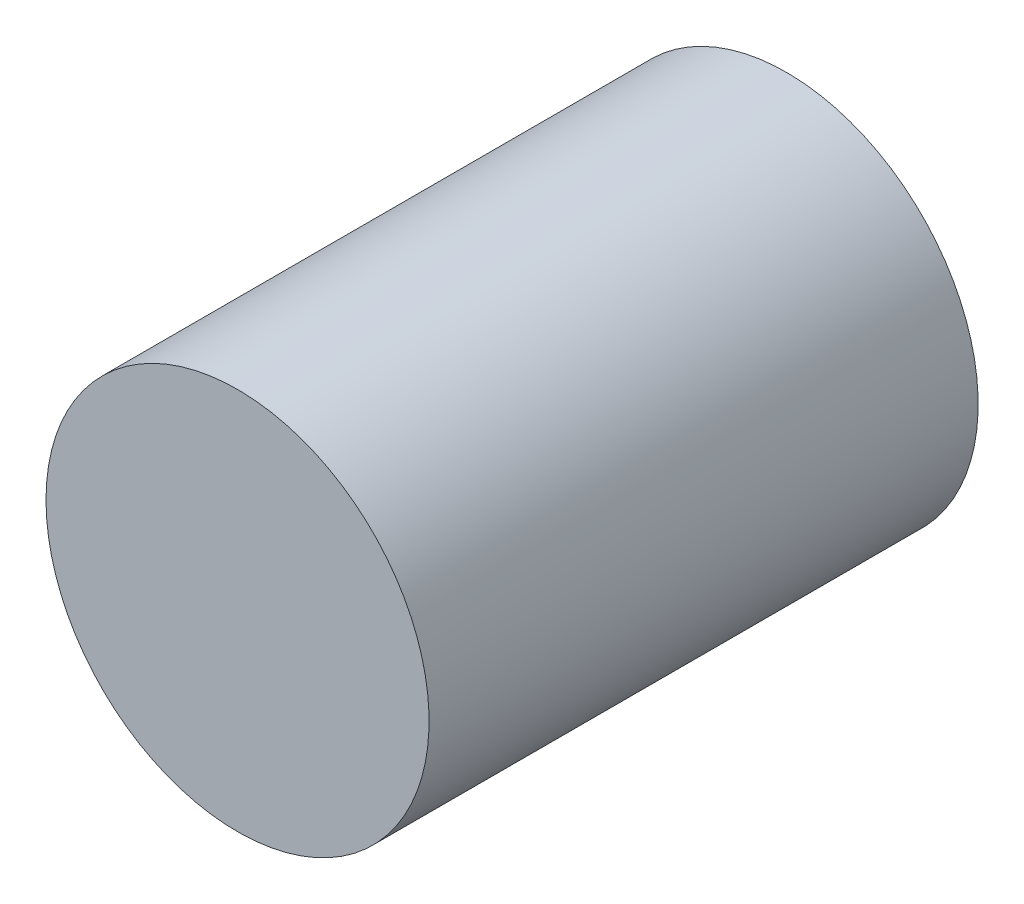
ISO-10303-21;
HEADER;
FILE_DESCRIPTION(('STEP AP214'),'2;1');
FILE_NAME('part.step','',(''),(''),'','','');
FILE_SCHEMA(('AUTOMOTIVE_DESIGN { 1 0 10303 214 1 1 1 1 }'));
ENDSEC;
DATA;
#1=APPLICATION_CONTEXT('core data for automotive mechanical design processes');
#2=APPLICATION_PROTOCOL_DEFINITION('international standard','automotive_design',2000,#1);
#3=PRODUCT_CONTEXT('',#1,'mechanical');
#4=PRODUCT('Part','Part','',(#3));
#5=PRODUCT_RELATED_PRODUCT_CATEGORY('part','',(#4));
#6=PRODUCT_DEFINITION_FORMATION('','',#4);
#7=PRODUCT_DEFINITION_CONTEXT('part definition',#1,'design');
#8=PRODUCT_DEFINITION('design','',#6,#7);
#9=PRODUCT_DEFINITION_SHAPE('','',#8);
#10=(LENGTH_UNIT() NAMED_UNIT(*) SI_UNIT(.MILLI.,.METRE.));
#11=(NAMED_UNIT(*) PLANE_ANGLE_UNIT() SI_UNIT($,.RADIAN.));
#12=(NAMED_UNIT(*) SI_UNIT($,.STERADIAN.) SOLID_ANGLE_UNIT());
#13=UNCERTAINTY_MEASURE_WITH_UNIT(LENGTH_MEASURE(1.E-05),#10,'distance_accuracy_value','');
#14=(GEOMETRIC_REPRESENTATION_CONTEXT(3) GLOBAL_UNCERTAINTY_ASSIGNED_CONTEXT((#13)) GLOBAL_UNIT_ASSIGNED_CONTEXT((#10,
#11,#12)) REPRESENTATION_CONTEXT('',''));
#15=CARTESIAN_POINT('',(0.,0.,0.));
#16=DIRECTION('',(0.,0.,1.));
#17=DIRECTION('',(1.,0.,0.));
#18=AXIS2_PLACEMENT_3D('',#15,#16,#17);
#19=CARTESIAN_POINT('',(0.,0.,8.6));
#20=DIRECTION('',(0.,0.,-1.));
#21=DIRECTION('',(-1.,0.,0.));
#22=AXIS2_PLACEMENT_3D('',#19,#20,#21);
#23=CYLINDRICAL_SURFACE('',#22,3.);
#24=CARTESIAN_POINT('',(0.,0.,8.6));
#25=DIRECTION('',(0.,0.,1.));
#26=DIRECTION('',(1.,0.,0.));
#27=AXIS2_PLACEMENT_3D('',#24,#25,#26);
#28=CIRCLE('',#27,3.);
#29=CARTESIAN_POINT('',(-3.,0.,8.6));
#30=VERTEX_POINT('',#29);
#31=EDGE_CURVE('E10',#30,#30,#28,.T.);
#32=CARTESIAN_POINT('',(0.,0.,0.));
#33=DIRECTION('',(0.,0.,1.));
#34=DIRECTION('',(1.,0.,0.));
#35=AXIS2_PLACEMENT_3D('',#32,#33,#34);
#36=CIRCLE('',#35,3.);
#37=CARTESIAN_POINT('',(-3.,0.,0.));
#38=VERTEX_POINT('',#37);
#39=EDGE_CURVE('E34',#38,#38,#36,.T.);
#40=CARTESIAN_POINT('',(-3.,0.,8.6));
#41=CARTESIAN_POINT('',(-3.,0.,8.51041666666666));
#42=CARTESIAN_POINT('',(-3.,0.,8.42083333333333));
#43=CARTESIAN_POINT('',(-3.,0.,8.24166666666667));
#44=CARTESIAN_POINT('',(-3.,0.,8.15208333333333));
#45=CARTESIAN_POINT('',(-3.,0.,7.97291666666667));
#46=CARTESIAN_POINT('',(-3.,0.,7.88333333333333));
#47=CARTESIAN_POINT('',(-3.,0.,7.70416666666667));
#48=CARTESIAN_POINT('',(-3.,0.,7.61458333333333));
#49=CARTESIAN_POINT('',(-3.,0.,7.43541666666667));
#50=CARTESIAN_POINT('',(-3.,0.,7.34583333333333));
#51=CARTESIAN_POINT('',(-3.,0.,7.16666666666667));
#52=CARTESIAN_POINT('',(-3.,0.,7.07708333333333));
#53=CARTESIAN_POINT('',(-3.,0.,6.89791666666667));
#54=CARTESIAN_POINT('',(-3.,0.,6.80833333333333));
#55=CARTESIAN_POINT('',(-3.,0.,6.62916666666667));
#56=CARTESIAN_POINT('',(-3.,0.,6.53958333333333));
#57=CARTESIAN_POINT('',(-3.,0.,6.36041666666667));
#58=CARTESIAN_POINT('',(-3.,0.,6.27083333333333));
#59=CARTESIAN_POINT('',(-3.,0.,6.09166666666667));
#60=CARTESIAN_POINT('',(-3.,0.,6.00208333333333));
#61=CARTESIAN_POINT('',(-3.,0.,5.82291666666667));
#62=CARTESIAN_POINT('',(-3.,0.,5.73333333333333));
#63=CARTESIAN_POINT('',(-3.,0.,5.55416666666667));
#64=CARTESIAN_POINT('',(-3.,0.,5.46458333333333));
#65=CARTESIAN_POINT('',(-3.,0.,5.28541666666667));
#66=CARTESIAN_POINT('',(-3.,0.,5.19583333333333));
#67=CARTESIAN_POINT('',(-3.,0.,5.01666666666667));
#68=CARTESIAN_POINT('',(-3.,0.,4.92708333333333));
#69=CARTESIAN_POINT('',(-3.,0.,4.74791666666667));
#70=CARTESIAN_POINT('',(-3.,0.,4.65833333333333));
#71=CARTESIAN_POINT('',(-3.,0.,4.47916666666667));
#72=CARTESIAN_POINT('',(-3.,0.,4.38958333333333));
#73=CARTESIAN_POINT('',(-3.,0.,4.21041666666667));
#74=CARTESIAN_POINT('',(-3.,0.,4.12083333333333));
#75=CARTESIAN_POINT('',(-3.,0.,3.94166666666667));
#76=CARTESIAN_POINT('',(-3.,0.,3.85208333333333));
#77=CARTESIAN_POINT('',(-3.,0.,3.67291666666667));
#78=CARTESIAN_POINT('',(-3.,0.,3.58333333333333));
#79=CARTESIAN_POINT('',(-3.,0.,3.40416666666667));
#80=CARTESIAN_POINT('',(-3.,0.,3.31458333333333));
#81=CARTESIAN_POINT('',(-3.,0.,3.13541666666667));
#82=CARTESIAN_POINT('',(-3.,0.,3.04583333333333));
#83=CARTESIAN_POINT('',(-3.,0.,2.86666666666667));
#84=CARTESIAN_POINT('',(-3.,0.,2.77708333333333));
#85=CARTESIAN_POINT('',(-3.,0.,2.59791666666667));
#86=CARTESIAN_POINT('',(-3.,0.,2.50833333333333));
#87=CARTESIAN_POINT('',(-3.,0.,2.32916666666667));
#88=CARTESIAN_POINT('',(-3.,0.,2.23958333333333));
#89=CARTESIAN_POINT('',(-3.,0.,2.06041666666667));
#90=CARTESIAN_POINT('',(-3.,0.,1.97083333333333));
#91=CARTESIAN_POINT('',(-3.,0.,1.79166666666667));
#92=CARTESIAN_POINT('',(-3.,0.,1.70208333333333));
#93=CARTESIAN_POINT('',(-3.,0.,1.52291666666667));
#94=CARTESIAN_POINT('',(-3.,0.,1.43333333333333));
#95=CARTESIAN_POINT('',(-3.,0.,1.25416666666667));
#96=CARTESIAN_POINT('',(-3.,0.,1.16458333333333));
#97=CARTESIAN_POINT('',(-3.,0.,0.985416666666665));
#98=CARTESIAN_POINT('',(-3.,0.,0.895833333333332));
#99=CARTESIAN_POINT('',(-3.,0.,0.716666666666665));
#100=CARTESIAN_POINT('',(-3.,0.,0.627083333333332));
#101=CARTESIAN_POINT('',(-3.,0.,0.447916666666665));
#102=CARTESIAN_POINT('',(-3.,0.,0.358333333333331));
#103=CARTESIAN_POINT('',(-3.,0.,0.179166666666665));
#104=CARTESIAN_POINT('',(-3.,0.,0.0895833333333315));
#105=CARTESIAN_POINT('',(-3.,0.,0.));
#106=B_SPLINE_CURVE_WITH_KNOTS('',3,(#40,#41,#42,#43,#44,#45,#46,#47,#48,#49,#50,#51,#52,#53,
#54,#55,#56,#57,#58,#59,#60,#61,#62,#63,#64,#65,#66,#67,#68,#69,#70,#71,#72,#73,#74,#75,#76,#77,
#78,#79,#80,#81,#82,#83,#84,#85,#86,#87,#88,#89,#90,#91,#92,#93,#94,#95,#96,#97,#98,#99,#100,
#101,#102,#103,#104,#105),.UNSPECIFIED.,.F.,.F.,(4,2,2,2,2,2,2,2,2,2,2,2,2,2,2,2,2,2,2,2,2,2,2,
2,2,2,2,2,2,2,2,2,4),(0.,0.26875,0.5375,0.806249999999999,1.075,1.34375,1.6125,1.88125,2.15,
2.41875,2.6875,2.95625,3.225,3.49375,3.7625,4.03125,4.3,4.56875,4.8375,5.10625,5.375,5.64375,
5.9125,6.18125,6.45,6.71875,6.9875,7.25625,7.525,7.79375,8.0625,8.33125,8.6),.UNSPECIFIED.);
#107=EDGE_CURVE('BSEAM31',#30,#38,#106,.T.);
#108=ORIENTED_EDGE('',*,*,#31,.F.);
#109=ORIENTED_EDGE('',*,*,#39,.T.);
#110=ORIENTED_EDGE('',*,*,#107,.T.);
#111=ORIENTED_EDGE('',*,*,#107,.F.);
#112=EDGE_LOOP('',(#108,#110,#109,#111));
#113=FACE_BOUND('',#112,.T.);
#114=ADVANCED_FACE('F31',(#113),#23,.T.);
#115=CARTESIAN_POINT('',(0.,0.,8.6));
#116=DIRECTION('',(0.,0.,1.));
#117=DIRECTION('',(1.,0.,0.));
#118=AXIS2_PLACEMENT_3D('',#115,#116,#117);
#119=PLANE('',#118);
#120=ORIENTED_EDGE('',*,*,#31,.T.);
#121=EDGE_LOOP('',(#120));
#122=FACE_BOUND('',#121,.T.);
#123=ADVANCED_FACE('F46',(#122),#119,.T.);
#124=CARTESIAN_POINT('',(0.,0.,0.));
#125=DIRECTION('',(0.,0.,1.));
#126=DIRECTION('',(1.,0.,0.));
#127=AXIS2_PLACEMENT_3D('',#124,#125,#126);
#128=PLANE('',#127);
#129=ORIENTED_EDGE('',*,*,#39,.F.);
#130=EDGE_LOOP('',(#129));
#131=FACE_BOUND('',#130,.T.);
#132=ADVANCED_FACE('F44',(#131),#128,.F.);
#133=CLOSED_SHELL('',(#114,#123,#132));
#134=MANIFOLD_SOLID_BREP('B2',#133);
#135=ADVANCED_BREP_SHAPE_REPRESENTATION('',(#18,#134),#14);
#136=SHAPE_DEFINITION_REPRESENTATION(#9,#135);
ENDSEC;
END-ISO-10303-21;
